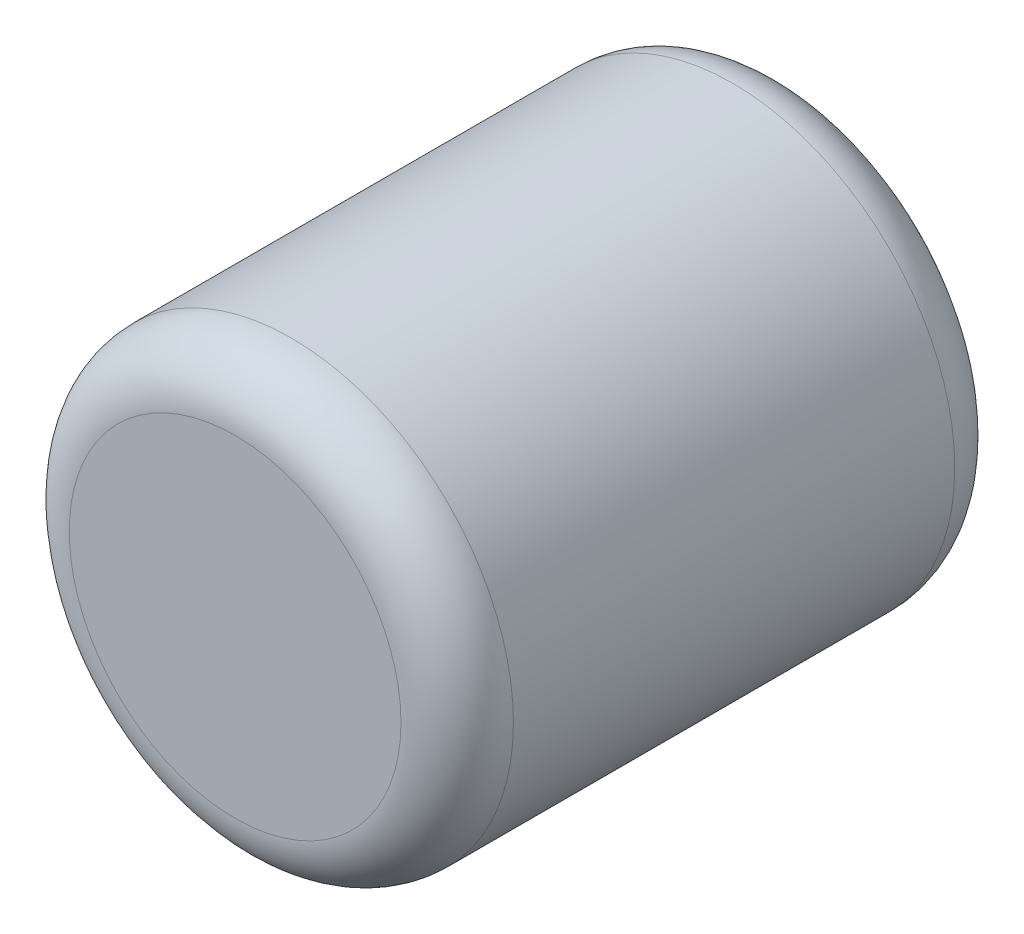
ISO-10303-21;
HEADER;
FILE_DESCRIPTION(('STEP AP214'),'2;1');
FILE_NAME('part.step','',(''),(''),'','','');
FILE_SCHEMA(('AUTOMOTIVE_DESIGN { 1 0 10303 214 1 1 1 1 }'));
ENDSEC;
DATA;
#1=APPLICATION_CONTEXT('core data for automotive mechanical design processes');
#2=APPLICATION_PROTOCOL_DEFINITION('international standard','automotive_design',2000,#1);
#3=PRODUCT_CONTEXT('',#1,'mechanical');
#4=PRODUCT('Part','Part','',(#3));
#5=PRODUCT_RELATED_PRODUCT_CATEGORY('part','',(#4));
#6=PRODUCT_DEFINITION_FORMATION('','',#4);
#7=PRODUCT_DEFINITION_CONTEXT('part definition',#1,'design');
#8=PRODUCT_DEFINITION('design','',#6,#7);
#9=PRODUCT_DEFINITION_SHAPE('','',#8);
#10=(LENGTH_UNIT() NAMED_UNIT(*) SI_UNIT(.MILLI.,.METRE.));
#11=(NAMED_UNIT(*) PLANE_ANGLE_UNIT() SI_UNIT($,.RADIAN.));
#12=(NAMED_UNIT(*) SI_UNIT($,.STERADIAN.) SOLID_ANGLE_UNIT());
#13=UNCERTAINTY_MEASURE_WITH_UNIT(LENGTH_MEASURE(1.E-05),#10,'distance_accuracy_value','');
#14=(GEOMETRIC_REPRESENTATION_CONTEXT(3) GLOBAL_UNCERTAINTY_ASSIGNED_CONTEXT((#13)) GLOBAL_UNIT_ASSIGNED_CONTEXT((#10,
#11,#12)) REPRESENTATION_CONTEXT('',''));
#15=CARTESIAN_POINT('',(0.,0.,0.));
#16=DIRECTION('',(0.,0.,1.));
#17=DIRECTION('',(1.,0.,0.));
#18=AXIS2_PLACEMENT_3D('',#15,#16,#17);
#19=CARTESIAN_POINT('',(0.,0.,9.85));
#20=DIRECTION('',(0.,0.,-1.));
#21=DIRECTION('',(-1.,0.,0.));
#22=AXIS2_PLACEMENT_3D('',#19,#20,#21);
#23=CYLINDRICAL_SURFACE('',#22,3.95);
#24=CARTESIAN_POINT('',(0.,0.,8.85));
#25=DIRECTION('',(0.,0.,1.));
#26=DIRECTION('',(1.,0.,0.));
#27=AXIS2_PLACEMENT_3D('',#24,#25,#26);
#28=CIRCLE('',#27,3.95);
#29=CARTESIAN_POINT('',(3.95,0.,8.85));
#30=VERTEX_POINT('',#29);
#31=EDGE_CURVE('E51',#30,#30,#28,.F.);
#32=ORIENTED_EDGE('',*,*,#31,.T.);
#33=EDGE_LOOP('',(#32));
#34=FACE_BOUND('',#33,.T.);
#35=CARTESIAN_POINT('',(0.,0.,0.999999999999999));
#36=DIRECTION('',(0.,0.,1.));
#37=DIRECTION('',(1.,0.,0.));
#38=AXIS2_PLACEMENT_3D('',#35,#36,#37);
#39=CIRCLE('',#38,3.95);
#40=CARTESIAN_POINT('',(3.95,0.,0.999999999999999));
#41=VERTEX_POINT('',#40);
#42=EDGE_CURVE('E56',#41,#41,#39,.T.);
#43=ORIENTED_EDGE('',*,*,#42,.T.);
#44=EDGE_LOOP('',(#43));
#45=FACE_BOUND('',#44,.T.);
#46=ADVANCED_FACE('F43',(#34,#45),#23,.T.);
#47=CARTESIAN_POINT('',(0.,0.,9.85));
#48=DIRECTION('',(0.,0.,1.));
#49=DIRECTION('',(1.,0.,0.));
#50=AXIS2_PLACEMENT_3D('',#47,#48,#49);
#51=PLANE('',#50);
#52=CARTESIAN_POINT('',(0.,0.,9.85));
#53=DIRECTION('',(0.,0.,1.));
#54=DIRECTION('',(1.,0.,0.));
#55=AXIS2_PLACEMENT_3D('',#52,#53,#54);
#56=CIRCLE('',#55,2.95);
#57=CARTESIAN_POINT('',(2.95,0.,9.85));
#58=VERTEX_POINT('',#57);
#59=EDGE_CURVE('E61',#58,#58,#56,.T.);
#60=ORIENTED_EDGE('',*,*,#59,.T.);
#61=EDGE_LOOP('',(#60));
#62=FACE_BOUND('',#61,.T.);
#63=ADVANCED_FACE('F68',(#62),#51,.T.);
#64=CARTESIAN_POINT('',(0.,0.,0.));
#65=DIRECTION('',(0.,0.,1.));
#66=DIRECTION('',(1.,0.,0.));
#67=AXIS2_PLACEMENT_3D('',#64,#65,#66);
#68=PLANE('',#67);
#69=CARTESIAN_POINT('',(0.,0.,0.));
#70=DIRECTION('',(0.,0.,1.));
#71=DIRECTION('',(1.,0.,0.));
#72=AXIS2_PLACEMENT_3D('',#69,#70,#71);
#73=CIRCLE('',#72,2.95);
#74=CARTESIAN_POINT('',(2.95,0.,0.));
#75=VERTEX_POINT('',#74);
#76=EDGE_CURVE('E10',#75,#75,#73,.F.);
#77=ORIENTED_EDGE('',*,*,#76,.T.);
#78=EDGE_LOOP('',(#77));
#79=FACE_BOUND('',#78,.T.);
#80=ADVANCED_FACE('F72',(#79),#68,.F.);
#81=CARTESIAN_POINT('',(0.,0.,8.85));
#82=DIRECTION('',(0.,0.,1.));
#83=DIRECTION('',(1.,0.,0.));
#84=AXIS2_PLACEMENT_3D('',#81,#82,#83);
#85=TOROIDAL_SURFACE('',#84,2.95,1.);
#86=ORIENTED_EDGE('',*,*,#31,.F.);
#87=EDGE_LOOP('',(#86));
#88=FACE_BOUND('',#87,.T.);
#89=ORIENTED_EDGE('',*,*,#59,.F.);
#90=EDGE_LOOP('',(#89));
#91=FACE_BOUND('',#90,.T.);
#92=ADVANCED_FACE('F70',(#88,#91),#85,.T.);
#93=CARTESIAN_POINT('',(0.,0.,0.999999999999999));
#94=DIRECTION('',(0.,0.,1.));
#95=DIRECTION('',(1.,0.,0.));
#96=AXIS2_PLACEMENT_3D('',#93,#94,#95);
#97=TOROIDAL_SURFACE('',#96,2.95,1.);
#98=ORIENTED_EDGE('',*,*,#76,.F.);
#99=EDGE_LOOP('',(#98));
#100=FACE_BOUND('',#99,.T.);
#101=ORIENTED_EDGE('',*,*,#42,.F.);
#102=EDGE_LOOP('',(#101));
#103=FACE_BOUND('',#102,.T.);
#104=ADVANCED_FACE('F45',(#100,#103),#97,.T.);
#105=CLOSED_SHELL('',(#46,#63,#80,#92,#104));
#106=MANIFOLD_SOLID_BREP('B2',#105);
#107=ADVANCED_BREP_SHAPE_REPRESENTATION('',(#18,#106),#14);
#108=SHAPE_DEFINITION_REPRESENTATION(#9,#107);
ENDSEC;
END-ISO-10303-21;
